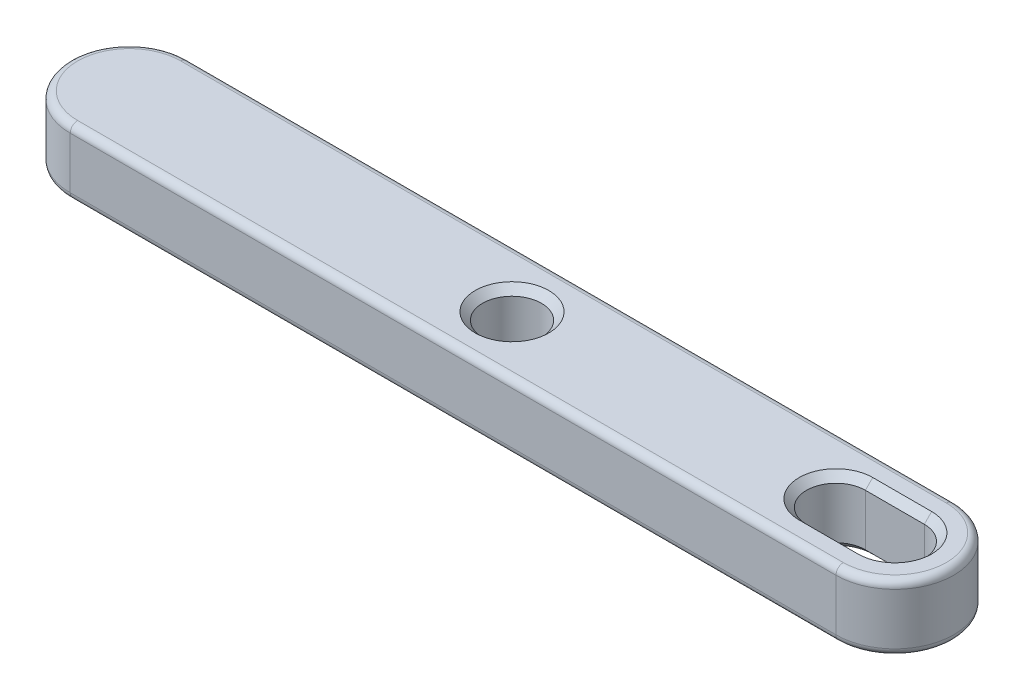
ISO-10303-21;
HEADER;
FILE_DESCRIPTION(('STEP AP214'),'2;1');
FILE_NAME('part.step','',(''),(''),'','','');
FILE_SCHEMA(('AUTOMOTIVE_DESIGN { 1 0 10303 214 1 1 1 1 }'));
ENDSEC;
DATA;
#1=APPLICATION_CONTEXT('core data for automotive mechanical design processes');
#2=APPLICATION_PROTOCOL_DEFINITION('international standard','automotive_design',2000,#1);
#3=PRODUCT_CONTEXT('',#1,'mechanical');
#4=PRODUCT('Part','Part','',(#3));
#5=PRODUCT_RELATED_PRODUCT_CATEGORY('part','',(#4));
#6=PRODUCT_DEFINITION_FORMATION('','',#4);
#7=PRODUCT_DEFINITION_CONTEXT('part definition',#1,'design');
#8=PRODUCT_DEFINITION('design','',#6,#7);
#9=PRODUCT_DEFINITION_SHAPE('','',#8);
#10=(LENGTH_UNIT() NAMED_UNIT(*) SI_UNIT(.MILLI.,.METRE.));
#11=(NAMED_UNIT(*) PLANE_ANGLE_UNIT() SI_UNIT($,.RADIAN.));
#12=(NAMED_UNIT(*) SI_UNIT($,.STERADIAN.) SOLID_ANGLE_UNIT());
#13=UNCERTAINTY_MEASURE_WITH_UNIT(LENGTH_MEASURE(1.E-05),#10,'distance_accuracy_value','');
#14=(GEOMETRIC_REPRESENTATION_CONTEXT(3) GLOBAL_UNCERTAINTY_ASSIGNED_CONTEXT((#13)) GLOBAL_UNIT_ASSIGNED_CONTEXT((#10,
#11,#12)) REPRESENTATION_CONTEXT('',''));
#15=CARTESIAN_POINT('',(0.,0.,0.));
#16=DIRECTION('',(0.,0.,1.));
#17=DIRECTION('',(1.,0.,0.));
#18=AXIS2_PLACEMENT_3D('',#15,#16,#17);
#19=CARTESIAN_POINT('',(-26.,2.25,0.));
#20=DIRECTION('',(0.,1.,0.));
#21=DIRECTION('',(0.,0.,1.));
#22=AXIS2_PLACEMENT_3D('',#19,#20,#21);
#23=PLANE('',#22);
#24=DIRECTION('',(-1.,0.,0.));
#25=VECTOR('',#24,1.);
#26=CARTESIAN_POINT('',(-26.,2.25,-3.5));
#27=LINE('',#26,#25);
#28=CARTESIAN_POINT('',(26.,2.25,-3.5));
#29=VERTEX_POINT('',#28);
#30=CARTESIAN_POINT('',(-26.,2.25,-3.5));
#31=VERTEX_POINT('',#30);
#32=EDGE_CURVE('E205',#29,#31,#27,.T.);
#33=ORIENTED_EDGE('',*,*,#32,.T.);
#34=CARTESIAN_POINT('',(-26.,2.25,0.));
#35=DIRECTION('',(0.,1.,0.));
#36=DIRECTION('',(0.,0.,1.));
#37=AXIS2_PLACEMENT_3D('',#34,#35,#36);
#38=CIRCLE('',#37,3.5);
#39=CARTESIAN_POINT('',(-26.,2.25,3.5));
#40=VERTEX_POINT('',#39);
#41=EDGE_CURVE('E207',#31,#40,#38,.T.);
#42=ORIENTED_EDGE('',*,*,#41,.T.);
#43=DIRECTION('',(1.,0.,0.));
#44=VECTOR('',#43,1.);
#45=CARTESIAN_POINT('',(26.,2.25,3.5));
#46=LINE('',#45,#44);
#47=CARTESIAN_POINT('',(26.,2.25,3.5));
#48=VERTEX_POINT('',#47);
#49=EDGE_CURVE('E200',#40,#48,#46,.T.);
#50=ORIENTED_EDGE('',*,*,#49,.T.);
#51=CARTESIAN_POINT('',(26.,2.25,0.));
#52=DIRECTION('',(0.,1.,0.));
#53=DIRECTION('',(0.,0.,1.));
#54=AXIS2_PLACEMENT_3D('',#51,#52,#53);
#55=CIRCLE('',#54,3.5);
#56=EDGE_CURVE('E202',#48,#29,#55,.T.);
#57=ORIENTED_EDGE('',*,*,#56,.T.);
#58=EDGE_LOOP('',(#33,#42,#50,#57));
#59=FACE_BOUND('',#58,.T.);
#60=CARTESIAN_POINT('',(26.,2.25,0.));
#61=DIRECTION('',(0.,1.,0.));
#62=DIRECTION('',(0.,0.,1.));
#63=AXIS2_PLACEMENT_3D('',#60,#61,#62);
#64=CIRCLE('',#63,2.50000000000001);
#65=CARTESIAN_POINT('',(26.,2.25,-2.50000000000001));
#66=VERTEX_POINT('',#65);
#67=CARTESIAN_POINT('',(26.,2.25,2.50000000000001));
#68=VERTEX_POINT('',#67);
#69=EDGE_CURVE('E313',#66,#68,#64,.F.);
#70=ORIENTED_EDGE('',*,*,#69,.T.);
#71=DIRECTION('',(-1.,0.,0.));
#72=VECTOR('',#71,1.);
#73=CARTESIAN_POINT('',(-26.,2.25,2.50000000000002));
#74=LINE('',#73,#72);
#75=CARTESIAN_POINT('',(22.,2.25,2.50000000000001));
#76=VERTEX_POINT('',#75);
#77=EDGE_CURVE('E203',#68,#76,#74,.T.);
#78=ORIENTED_EDGE('',*,*,#77,.T.);
#79=CARTESIAN_POINT('',(22.,2.25,0.));
#80=DIRECTION('',(0.,1.,0.));
#81=DIRECTION('',(0.,0.,1.));
#82=AXIS2_PLACEMENT_3D('',#79,#80,#81);
#83=CIRCLE('',#82,2.50000000000002);
#84=CARTESIAN_POINT('',(22.,2.25,-2.50000000000002));
#85=VERTEX_POINT('',#84);
#86=EDGE_CURVE('E311',#76,#85,#83,.F.);
#87=ORIENTED_EDGE('',*,*,#86,.T.);
#88=DIRECTION('',(1.,0.,0.));
#89=VECTOR('',#88,1.);
#90=CARTESIAN_POINT('',(-26.,2.25,-2.50000000000015));
#91=LINE('',#90,#89);
#92=EDGE_CURVE('E309',#85,#66,#91,.T.);
#93=ORIENTED_EDGE('',*,*,#92,.T.);
#94=EDGE_LOOP('',(#70,#78,#87,#93));
#95=FACE_BOUND('',#94,.T.);
#96=CARTESIAN_POINT('',(0.,2.25,0.));
#97=DIRECTION('',(0.,1.,0.));
#98=DIRECTION('',(0.,0.,1.));
#99=AXIS2_PLACEMENT_3D('',#96,#97,#98);
#100=CIRCLE('',#99,2.50000000000003);
#101=CARTESIAN_POINT('',(0.,2.25,2.50000000000003));
#102=VERTEX_POINT('',#101);
#103=EDGE_CURVE('E306',#102,#102,#100,.F.);
#104=ORIENTED_EDGE('',*,*,#103,.T.);
#105=EDGE_LOOP('',(#104));
#106=FACE_BOUND('',#105,.T.);
#107=ADVANCED_FACE('F39',(#59,#95,#106),#23,.T.);
#108=CARTESIAN_POINT('',(-26.,-2.25,0.));
#109=DIRECTION('',(0.,1.,0.));
#110=DIRECTION('',(0.,0.,1.));
#111=AXIS2_PLACEMENT_3D('',#108,#109,#110);
#112=PLANE('',#111);
#113=DIRECTION('',(1.,0.,0.));
#114=VECTOR('',#113,1.);
#115=CARTESIAN_POINT('',(-26.,-2.25,3.5));
#116=LINE('',#115,#114);
#117=CARTESIAN_POINT('',(26.,-2.25,3.5));
#118=VERTEX_POINT('',#117);
#119=CARTESIAN_POINT('',(-26.,-2.25,3.5));
#120=VERTEX_POINT('',#119);
#121=EDGE_CURVE('E224',#118,#120,#116,.F.);
#122=ORIENTED_EDGE('',*,*,#121,.T.);
#123=CARTESIAN_POINT('',(-26.,-2.25,0.));
#124=DIRECTION('',(0.,1.,0.));
#125=DIRECTION('',(0.,0.,1.));
#126=AXIS2_PLACEMENT_3D('',#123,#124,#125);
#127=CIRCLE('',#126,3.5);
#128=CARTESIAN_POINT('',(-26.,-2.25,-3.5));
#129=VERTEX_POINT('',#128);
#130=EDGE_CURVE('E229',#120,#129,#127,.F.);
#131=ORIENTED_EDGE('',*,*,#130,.T.);
#132=DIRECTION('',(-1.,0.,0.));
#133=VECTOR('',#132,1.);
#134=CARTESIAN_POINT('',(-26.,-2.25,-3.5));
#135=LINE('',#134,#133);
#136=CARTESIAN_POINT('',(26.,-2.25,-3.5));
#137=VERTEX_POINT('',#136);
#138=EDGE_CURVE('E63',#129,#137,#135,.F.);
#139=ORIENTED_EDGE('',*,*,#138,.T.);
#140=CARTESIAN_POINT('',(26.,-2.25,0.));
#141=DIRECTION('',(0.,1.,0.));
#142=DIRECTION('',(0.,0.,1.));
#143=AXIS2_PLACEMENT_3D('',#140,#141,#142);
#144=CIRCLE('',#143,3.5);
#145=EDGE_CURVE('E226',#137,#118,#144,.F.);
#146=ORIENTED_EDGE('',*,*,#145,.T.);
#147=EDGE_LOOP('',(#122,#131,#139,#146));
#148=FACE_BOUND('',#147,.T.);
#149=DIRECTION('',(1.,0.,0.));
#150=VECTOR('',#149,1.);
#151=CARTESIAN_POINT('',(26.,-2.25,2.50000000000001));
#152=LINE('',#151,#150);
#153=CARTESIAN_POINT('',(22.,-2.25,2.5));
#154=VERTEX_POINT('',#153);
#155=CARTESIAN_POINT('',(26.,-2.25,2.50000000000001));
#156=VERTEX_POINT('',#155);
#157=EDGE_CURVE('E166',#154,#156,#152,.T.);
#158=ORIENTED_EDGE('',*,*,#157,.T.);
#159=CARTESIAN_POINT('',(26.,-2.25,0.));
#160=DIRECTION('',(0.,1.,0.));
#161=DIRECTION('',(0.,0.,1.));
#162=AXIS2_PLACEMENT_3D('',#159,#160,#161);
#163=CIRCLE('',#162,2.5);
#164=CARTESIAN_POINT('',(26.,-2.25,-2.5));
#165=VERTEX_POINT('',#164);
#166=EDGE_CURVE('E162',#156,#165,#163,.T.);
#167=ORIENTED_EDGE('',*,*,#166,.T.);
#168=DIRECTION('',(-1.,0.,0.));
#169=VECTOR('',#168,1.);
#170=CARTESIAN_POINT('',(22.,-2.25,-2.50000000000001));
#171=LINE('',#170,#169);
#172=CARTESIAN_POINT('',(22.,-2.25,-2.50000000000001));
#173=VERTEX_POINT('',#172);
#174=EDGE_CURVE('E155',#165,#173,#171,.T.);
#175=ORIENTED_EDGE('',*,*,#174,.T.);
#176=CARTESIAN_POINT('',(22.,-2.25,0.));
#177=DIRECTION('',(0.,1.,0.));
#178=DIRECTION('',(0.,0.,1.));
#179=AXIS2_PLACEMENT_3D('',#176,#177,#178);
#180=CIRCLE('',#179,2.50000000000001);
#181=EDGE_CURVE('E159',#173,#154,#180,.T.);
#182=ORIENTED_EDGE('',*,*,#181,.T.);
#183=EDGE_LOOP('',(#158,#167,#175,#182));
#184=FACE_BOUND('',#183,.T.);
#185=CARTESIAN_POINT('',(0.,-2.25,0.));
#186=DIRECTION('',(0.,1.,0.));
#187=DIRECTION('',(0.,0.,1.));
#188=AXIS2_PLACEMENT_3D('',#185,#186,#187);
#189=CIRCLE('',#188,2.5);
#190=CARTESIAN_POINT('',(0.,-2.25,2.5));
#191=VERTEX_POINT('',#190);
#192=EDGE_CURVE('E177',#191,#191,#189,.T.);
#193=ORIENTED_EDGE('',*,*,#192,.T.);
#194=EDGE_LOOP('',(#193));
#195=FACE_BOUND('',#194,.T.);
#196=ADVANCED_FACE('F157',(#148,#184,#195),#112,.F.);
#197=CARTESIAN_POINT('',(-26.,2.25,0.));
#198=DIRECTION('',(0.,-1.,0.));
#199=DIRECTION('',(0.,0.,-1.));
#200=AXIS2_PLACEMENT_3D('',#197,#198,#199);
#201=CYLINDRICAL_SURFACE('',#200,4.);
#202=DIRECTION('',(0.,-1.,0.));
#203=VECTOR('',#202,1.);
#204=CARTESIAN_POINT('',(-26.,2.25,4.));
#205=LINE('',#204,#203);
#206=CARTESIAN_POINT('',(-26.,1.75,4.));
#207=VERTEX_POINT('',#206);
#208=CARTESIAN_POINT('',(-26.,-1.75,4.));
#209=VERTEX_POINT('',#208);
#210=EDGE_CURVE('E267',#207,#209,#205,.T.);
#211=ORIENTED_EDGE('',*,*,#210,.F.);
#212=CARTESIAN_POINT('',(-26.,1.75,0.));
#213=DIRECTION('',(0.,1.,0.));
#214=DIRECTION('',(0.,0.,1.));
#215=AXIS2_PLACEMENT_3D('',#212,#213,#214);
#216=CIRCLE('',#215,4.);
#217=CARTESIAN_POINT('',(-26.,1.75,-4.));
#218=VERTEX_POINT('',#217);
#219=EDGE_CURVE('E213',#207,#218,#216,.F.);
#220=ORIENTED_EDGE('',*,*,#219,.T.);
#221=DIRECTION('',(0.,-1.,0.));
#222=VECTOR('',#221,1.);
#223=CARTESIAN_POINT('',(-26.,2.25,-4.));
#224=LINE('',#223,#222);
#225=CARTESIAN_POINT('',(-26.,-1.75,-4.));
#226=VERTEX_POINT('',#225);
#227=EDGE_CURVE('E270',#218,#226,#224,.T.);
#228=ORIENTED_EDGE('',*,*,#227,.T.);
#229=CARTESIAN_POINT('',(-26.,-1.75,0.));
#230=DIRECTION('',(0.,1.,0.));
#231=DIRECTION('',(0.,0.,1.));
#232=AXIS2_PLACEMENT_3D('',#229,#230,#231);
#233=CIRCLE('',#232,4.);
#234=EDGE_CURVE('E210',#226,#209,#233,.T.);
#235=ORIENTED_EDGE('',*,*,#234,.T.);
#236=EDGE_LOOP('',(#211,#220,#228,#235));
#237=FACE_BOUND('',#236,.T.);
#238=ADVANCED_FACE('F266',(#237),#201,.T.);
#239=CARTESIAN_POINT('',(-26.,2.25,4.));
#240=DIRECTION('',(0.,0.,-1.));
#241=DIRECTION('',(-1.,0.,0.));
#242=AXIS2_PLACEMENT_3D('',#239,#240,#241);
#243=PLANE('',#242);
#244=DIRECTION('',(0.,-1.,0.));
#245=VECTOR('',#244,1.);
#246=CARTESIAN_POINT('',(26.,2.25,4.));
#247=LINE('',#246,#245);
#248=CARTESIAN_POINT('',(26.,1.75,4.));
#249=VERTEX_POINT('',#248);
#250=CARTESIAN_POINT('',(26.,-1.75,4.));
#251=VERTEX_POINT('',#250);
#252=EDGE_CURVE('E273',#249,#251,#247,.T.);
#253=ORIENTED_EDGE('',*,*,#252,.F.);
#254=DIRECTION('',(1.,0.,0.));
#255=VECTOR('',#254,1.);
#256=CARTESIAN_POINT('',(-26.,1.75,4.));
#257=LINE('',#256,#255);
#258=EDGE_CURVE('E11',#249,#207,#257,.F.);
#259=ORIENTED_EDGE('',*,*,#258,.T.);
#260=ORIENTED_EDGE('',*,*,#210,.T.);
#261=DIRECTION('',(1.,0.,0.));
#262=VECTOR('',#261,1.);
#263=CARTESIAN_POINT('',(-26.,-1.75,4.));
#264=LINE('',#263,#262);
#265=EDGE_CURVE('E48',#209,#251,#264,.T.);
#266=ORIENTED_EDGE('',*,*,#265,.T.);
#267=EDGE_LOOP('',(#253,#259,#260,#266));
#268=FACE_BOUND('',#267,.T.);
#269=ADVANCED_FACE('F271',(#268),#243,.F.);
#270=CARTESIAN_POINT('',(26.,2.25,0.));
#271=DIRECTION('',(0.,-1.,0.));
#272=DIRECTION('',(0.,0.,-1.));
#273=AXIS2_PLACEMENT_3D('',#270,#271,#272);
#274=CYLINDRICAL_SURFACE('',#273,4.);
#275=DIRECTION('',(0.,-1.,0.));
#276=VECTOR('',#275,1.);
#277=CARTESIAN_POINT('',(26.,2.25,-4.));
#278=LINE('',#277,#276);
#279=CARTESIAN_POINT('',(26.,1.75,-4.));
#280=VERTEX_POINT('',#279);
#281=CARTESIAN_POINT('',(26.,-1.75,-4.));
#282=VERTEX_POINT('',#281);
#283=EDGE_CURVE('E277',#280,#282,#278,.T.);
#284=ORIENTED_EDGE('',*,*,#283,.F.);
#285=CARTESIAN_POINT('',(26.,1.75,0.));
#286=DIRECTION('',(0.,1.,0.));
#287=DIRECTION('',(0.,0.,1.));
#288=AXIS2_PLACEMENT_3D('',#285,#286,#287);
#289=CIRCLE('',#288,4.);
#290=EDGE_CURVE('E222',#280,#249,#289,.F.);
#291=ORIENTED_EDGE('',*,*,#290,.T.);
#292=ORIENTED_EDGE('',*,*,#252,.T.);
#293=CARTESIAN_POINT('',(26.,-1.75,0.));
#294=DIRECTION('',(0.,1.,0.));
#295=DIRECTION('',(0.,0.,1.));
#296=AXIS2_PLACEMENT_3D('',#293,#294,#295);
#297=CIRCLE('',#296,4.);
#298=EDGE_CURVE('E220',#251,#282,#297,.T.);
#299=ORIENTED_EDGE('',*,*,#298,.T.);
#300=EDGE_LOOP('',(#284,#291,#292,#299));
#301=FACE_BOUND('',#300,.T.);
#302=ADVANCED_FACE('F348',(#301),#274,.T.);
#303=CARTESIAN_POINT('',(-26.,2.25,-4.));
#304=DIRECTION('',(0.,0.,1.));
#305=DIRECTION('',(1.,0.,0.));
#306=AXIS2_PLACEMENT_3D('',#303,#304,#305);
#307=PLANE('',#306);
#308=ORIENTED_EDGE('',*,*,#227,.F.);
#309=DIRECTION('',(-1.,0.,0.));
#310=VECTOR('',#309,1.);
#311=CARTESIAN_POINT('',(26.,1.75,-4.));
#312=LINE('',#311,#310);
#313=EDGE_CURVE('E218',#218,#280,#312,.F.);
#314=ORIENTED_EDGE('',*,*,#313,.T.);
#315=ORIENTED_EDGE('',*,*,#283,.T.);
#316=DIRECTION('',(-1.,0.,0.));
#317=VECTOR('',#316,1.);
#318=CARTESIAN_POINT('',(-26.,-1.75,-4.));
#319=LINE('',#318,#317);
#320=EDGE_CURVE('E216',#282,#226,#319,.T.);
#321=ORIENTED_EDGE('',*,*,#320,.T.);
#322=EDGE_LOOP('',(#308,#314,#315,#321));
#323=FACE_BOUND('',#322,.T.);
#324=ADVANCED_FACE('F344',(#323),#307,.F.);
#325=CARTESIAN_POINT('',(0.,2.25,0.));
#326=DIRECTION('',(0.,-1.,0.));
#327=DIRECTION('',(0.,0.,-1.));
#328=AXIS2_PLACEMENT_3D('',#325,#326,#327);
#329=CYLINDRICAL_SURFACE('',#328,2.);
#330=CARTESIAN_POINT('',(0.,-1.74999999999999,0.));
#331=DIRECTION('',(0.,1.,0.));
#332=DIRECTION('',(0.,0.,1.));
#333=AXIS2_PLACEMENT_3D('',#330,#331,#332);
#334=CIRCLE('',#333,2.);
#335=CARTESIAN_POINT('',(0.,-1.74999999999999,2.));
#336=VERTEX_POINT('',#335);
#337=EDGE_CURVE('E303',#336,#336,#334,.F.);
#338=ORIENTED_EDGE('',*,*,#337,.T.);
#339=EDGE_LOOP('',(#338));
#340=FACE_BOUND('',#339,.T.);
#341=CARTESIAN_POINT('',(0.,1.74999999999998,0.));
#342=DIRECTION('',(0.,1.,0.));
#343=DIRECTION('',(0.,0.,1.));
#344=AXIS2_PLACEMENT_3D('',#341,#342,#343);
#345=CIRCLE('',#344,2.);
#346=CARTESIAN_POINT('',(0.,1.74999999999998,2.));
#347=VERTEX_POINT('',#346);
#348=EDGE_CURVE('E300',#347,#347,#345,.T.);
#349=ORIENTED_EDGE('',*,*,#348,.T.);
#350=EDGE_LOOP('',(#349));
#351=FACE_BOUND('',#350,.T.);
#352=ADVANCED_FACE('F382',(#340,#351),#329,.F.);
#353=CARTESIAN_POINT('',(26.,2.25,0.));
#354=DIRECTION('',(0.,-1.,0.));
#355=DIRECTION('',(0.,0.,-1.));
#356=AXIS2_PLACEMENT_3D('',#353,#354,#355);
#357=CYLINDRICAL_SURFACE('',#356,2.);
#358=DIRECTION('',(0.,-1.,0.));
#359=VECTOR('',#358,1.);
#360=CARTESIAN_POINT('',(26.,2.25,-1.99999999999999));
#361=LINE('',#360,#359);
#362=CARTESIAN_POINT('',(26.,1.74999999999999,-1.99999999999999));
#363=VERTEX_POINT('',#362);
#364=CARTESIAN_POINT('',(26.,-1.74999999999999,-1.99999999999999));
#365=VERTEX_POINT('',#364);
#366=EDGE_CURVE('E327',#363,#365,#361,.T.);
#367=ORIENTED_EDGE('',*,*,#366,.T.);
#368=CARTESIAN_POINT('',(26.,-1.74999999999999,0.));
#369=DIRECTION('',(0.,1.,0.));
#370=DIRECTION('',(0.,0.,1.));
#371=AXIS2_PLACEMENT_3D('',#368,#369,#370);
#372=CIRCLE('',#371,2.);
#373=CARTESIAN_POINT('',(26.,-1.74999999999999,2.00000000000001));
#374=VERTEX_POINT('',#373);
#375=EDGE_CURVE('E285',#365,#374,#372,.F.);
#376=ORIENTED_EDGE('',*,*,#375,.T.);
#377=DIRECTION('',(0.,-1.,0.));
#378=VECTOR('',#377,1.);
#379=CARTESIAN_POINT('',(26.,2.25,2.00000000000001));
#380=LINE('',#379,#378);
#381=CARTESIAN_POINT('',(26.,1.74999999999999,2.00000000000001));
#382=VERTEX_POINT('',#381);
#383=EDGE_CURVE('E183',#382,#374,#380,.T.);
#384=ORIENTED_EDGE('',*,*,#383,.F.);
#385=CARTESIAN_POINT('',(26.,1.74999999999999,0.));
#386=DIRECTION('',(0.,1.,0.));
#387=DIRECTION('',(0.,0.,1.));
#388=AXIS2_PLACEMENT_3D('',#385,#386,#387);
#389=CIRCLE('',#388,2.);
#390=EDGE_CURVE('E283',#382,#363,#389,.T.);
#391=ORIENTED_EDGE('',*,*,#390,.T.);
#392=EDGE_LOOP('',(#367,#376,#384,#391));
#393=FACE_BOUND('',#392,.T.);
#394=ADVANCED_FACE('F325',(#393),#357,.F.);
#395=CARTESIAN_POINT('',(26.,2.25,-1.99999999999999));
#396=DIRECTION('',(0.,0.,1.));
#397=DIRECTION('',(1.,0.,0.));
#398=AXIS2_PLACEMENT_3D('',#395,#396,#397);
#399=PLANE('',#398);
#400=DIRECTION('',(0.,-1.,0.));
#401=VECTOR('',#400,1.);
#402=CARTESIAN_POINT('',(22.,2.25,-2.00000000000001));
#403=LINE('',#402,#401);
#404=CARTESIAN_POINT('',(22.,1.74999999999999,-2.00000000000001));
#405=VERTEX_POINT('',#404);
#406=CARTESIAN_POINT('',(22.,-1.74999999999999,-2.00000000000001));
#407=VERTEX_POINT('',#406);
#408=EDGE_CURVE('E335',#405,#407,#403,.T.);
#409=ORIENTED_EDGE('',*,*,#408,.T.);
#410=DIRECTION('',(1.,0.,0.));
#411=VECTOR('',#410,1.);
#412=CARTESIAN_POINT('',(26.,-1.74999999999999,-1.99999999999999));
#413=LINE('',#412,#411);
#414=EDGE_CURVE('E180',#407,#365,#413,.T.);
#415=ORIENTED_EDGE('',*,*,#414,.T.);
#416=ORIENTED_EDGE('',*,*,#366,.F.);
#417=DIRECTION('',(-1.,0.,0.));
#418=VECTOR('',#417,1.);
#419=CARTESIAN_POINT('',(26.,1.74999999999999,-1.99999999999999));
#420=LINE('',#419,#418);
#421=EDGE_CURVE('E288',#363,#405,#420,.T.);
#422=ORIENTED_EDGE('',*,*,#421,.T.);
#423=EDGE_LOOP('',(#409,#415,#416,#422));
#424=FACE_BOUND('',#423,.T.);
#425=ADVANCED_FACE('F468',(#424),#399,.T.);
#426=CARTESIAN_POINT('',(22.,2.25,0.));
#427=DIRECTION('',(0.,-1.,0.));
#428=DIRECTION('',(0.,0.,-1.));
#429=AXIS2_PLACEMENT_3D('',#426,#427,#428);
#430=CYLINDRICAL_SURFACE('',#429,2.00000000000001);
#431=DIRECTION('',(0.,-1.,0.));
#432=VECTOR('',#431,1.);
#433=CARTESIAN_POINT('',(22.,2.25,2.00000000000001));
#434=LINE('',#433,#432);
#435=CARTESIAN_POINT('',(22.,1.74999999999999,2.00000000000001));
#436=VERTEX_POINT('',#435);
#437=CARTESIAN_POINT('',(22.,-1.74999999999999,2.00000000000001));
#438=VERTEX_POINT('',#437);
#439=EDGE_CURVE('E333',#436,#438,#434,.T.);
#440=ORIENTED_EDGE('',*,*,#439,.T.);
#441=CARTESIAN_POINT('',(22.,-1.74999999999999,0.));
#442=DIRECTION('',(0.,1.,0.));
#443=DIRECTION('',(0.,0.,1.));
#444=AXIS2_PLACEMENT_3D('',#441,#442,#443);
#445=CIRCLE('',#444,2.00000000000001);
#446=EDGE_CURVE('E298',#438,#407,#445,.F.);
#447=ORIENTED_EDGE('',*,*,#446,.T.);
#448=ORIENTED_EDGE('',*,*,#408,.F.);
#449=CARTESIAN_POINT('',(22.,1.74999999999999,0.));
#450=DIRECTION('',(0.,1.,0.));
#451=DIRECTION('',(0.,0.,1.));
#452=AXIS2_PLACEMENT_3D('',#449,#450,#451);
#453=CIRCLE('',#452,2.00000000000001);
#454=EDGE_CURVE('E296',#405,#436,#453,.T.);
#455=ORIENTED_EDGE('',*,*,#454,.T.);
#456=EDGE_LOOP('',(#440,#447,#448,#455));
#457=FACE_BOUND('',#456,.T.);
#458=ADVANCED_FACE('F475',(#457),#430,.F.);
#459=CARTESIAN_POINT('',(26.,2.25,2.00000000000001));
#460=DIRECTION('',(0.,0.,-1.));
#461=DIRECTION('',(-1.,0.,0.));
#462=AXIS2_PLACEMENT_3D('',#459,#460,#461);
#463=PLANE('',#462);
#464=ORIENTED_EDGE('',*,*,#383,.T.);
#465=DIRECTION('',(-1.,0.,0.));
#466=VECTOR('',#465,1.);
#467=CARTESIAN_POINT('',(22.,-1.74999999999999,2.00000000000001));
#468=LINE('',#467,#466);
#469=EDGE_CURVE('E294',#374,#438,#468,.T.);
#470=ORIENTED_EDGE('',*,*,#469,.T.);
#471=ORIENTED_EDGE('',*,*,#439,.F.);
#472=DIRECTION('',(1.,0.,0.));
#473=VECTOR('',#472,1.);
#474=CARTESIAN_POINT('',(26.,1.74999999999999,2.00000000000001));
#475=LINE('',#474,#473);
#476=EDGE_CURVE('E291',#436,#382,#475,.T.);
#477=ORIENTED_EDGE('',*,*,#476,.T.);
#478=EDGE_LOOP('',(#464,#470,#471,#477));
#479=FACE_BOUND('',#478,.T.);
#480=ADVANCED_FACE('F329',(#479),#463,.T.);
#481=CARTESIAN_POINT('',(22.,-2.25,0.));
#482=DIRECTION('',(0.,-1.,0.));
#483=DIRECTION('',(0.,0.,-1.));
#484=AXIS2_PLACEMENT_3D('',#481,#482,#483);
#485=CONICAL_SURFACE('',#484,2.50000000000001,0.785398163397442);
#486=DIRECTION('',(0.,-0.707106781186552,-0.707106781186543));
#487=VECTOR('',#486,1.);
#488=CARTESIAN_POINT('',(22.,-1.74999999999999,-2.00000000000001));
#489=LINE('',#488,#487);
#490=EDGE_CURVE('E172',#407,#173,#489,.T.);
#491=ORIENTED_EDGE('',*,*,#490,.F.);
#492=ORIENTED_EDGE('',*,*,#446,.F.);
#493=DIRECTION('',(0.,0.707106781186552,-0.707106781186543));
#494=VECTOR('',#493,1.);
#495=CARTESIAN_POINT('',(22.,-2.25,2.5));
#496=LINE('',#495,#494);
#497=EDGE_CURVE('E175',#154,#438,#496,.T.);
#498=ORIENTED_EDGE('',*,*,#497,.F.);
#499=ORIENTED_EDGE('',*,*,#181,.F.);
#500=EDGE_LOOP('',(#491,#492,#498,#499));
#501=FACE_BOUND('',#500,.T.);
#502=ADVANCED_FACE('F170',(#501),#485,.F.);
#503=CARTESIAN_POINT('',(-26.,-2.25,2.50000000000001));
#504=DIRECTION('',(0.,-0.707106781186543,-0.707106781186552));
#505=DIRECTION('',(-1.,0.,0.));
#506=AXIS2_PLACEMENT_3D('',#503,#504,#505);
#507=PLANE('',#506);
#508=ORIENTED_EDGE('',*,*,#497,.T.);
#509=ORIENTED_EDGE('',*,*,#469,.F.);
#510=DIRECTION('',(0.,0.707106781186552,-0.707106781186543));
#511=VECTOR('',#510,1.);
#512=CARTESIAN_POINT('',(26.,-2.25,2.50000000000001));
#513=LINE('',#512,#511);
#514=EDGE_CURVE('E181',#156,#374,#513,.T.);
#515=ORIENTED_EDGE('',*,*,#514,.F.);
#516=ORIENTED_EDGE('',*,*,#157,.F.);
#517=EDGE_LOOP('',(#508,#509,#515,#516));
#518=FACE_BOUND('',#517,.T.);
#519=ADVANCED_FACE('F406',(#518),#507,.T.);
#520=CARTESIAN_POINT('',(-26.,-2.25,-2.50000000000014));
#521=DIRECTION('',(0.,-0.707106781186543,0.707106781186552));
#522=DIRECTION('',(1.,0.,0.));
#523=AXIS2_PLACEMENT_3D('',#520,#521,#522);
#524=PLANE('',#523);
#525=ORIENTED_EDGE('',*,*,#490,.T.);
#526=ORIENTED_EDGE('',*,*,#174,.F.);
#527=DIRECTION('',(0.,-0.707106781186552,-0.707106781186543));
#528=VECTOR('',#527,1.);
#529=CARTESIAN_POINT('',(26.,-1.74999999999999,-1.99999999999999));
#530=LINE('',#529,#528);
#531=EDGE_CURVE('E185',#365,#165,#530,.T.);
#532=ORIENTED_EDGE('',*,*,#531,.F.);
#533=ORIENTED_EDGE('',*,*,#414,.F.);
#534=EDGE_LOOP('',(#525,#526,#532,#533));
#535=FACE_BOUND('',#534,.T.);
#536=ADVANCED_FACE('F179',(#535),#524,.T.);
#537=CARTESIAN_POINT('',(26.,-2.25,0.));
#538=DIRECTION('',(0.,-1.,0.));
#539=DIRECTION('',(0.,0.,-1.));
#540=AXIS2_PLACEMENT_3D('',#537,#538,#539);
#541=CONICAL_SURFACE('',#540,2.5,0.785398163397442);
#542=ORIENTED_EDGE('',*,*,#514,.T.);
#543=ORIENTED_EDGE('',*,*,#375,.F.);
#544=ORIENTED_EDGE('',*,*,#531,.T.);
#545=ORIENTED_EDGE('',*,*,#166,.F.);
#546=EDGE_LOOP('',(#542,#543,#544,#545));
#547=FACE_BOUND('',#546,.T.);
#548=ADVANCED_FACE('F318',(#547),#541,.F.);
#549=CARTESIAN_POINT('',(0.,-2.25,0.));
#550=DIRECTION('',(0.,-1.,0.));
#551=DIRECTION('',(0.,0.,-1.));
#552=AXIS2_PLACEMENT_3D('',#549,#550,#551);
#553=CONICAL_SURFACE('',#552,2.5,0.785398163397441);
#554=ORIENTED_EDGE('',*,*,#337,.F.);
#555=EDGE_LOOP('',(#554));
#556=FACE_BOUND('',#555,.T.);
#557=ORIENTED_EDGE('',*,*,#192,.F.);
#558=EDGE_LOOP('',(#557));
#559=FACE_BOUND('',#558,.T.);
#560=ADVANCED_FACE('F400',(#556,#559),#553,.F.);
#561=CARTESIAN_POINT('',(26.,1.74999999999999,-1.99999999999999));
#562=DIRECTION('',(0.,-0.707106781186552,-0.707106781186543));
#563=DIRECTION('',(-1.,0.,0.));
#564=AXIS2_PLACEMENT_3D('',#561,#562,#563);
#565=PLANE('',#564);
#566=DIRECTION('',(0.,-0.707106781186543,0.707106781186552));
#567=VECTOR('',#566,1.);
#568=CARTESIAN_POINT('',(26.,2.25,-2.50000000000001));
#569=LINE('',#568,#567);
#570=EDGE_CURVE('E194',#66,#363,#569,.T.);
#571=ORIENTED_EDGE('',*,*,#570,.F.);
#572=ORIENTED_EDGE('',*,*,#92,.F.);
#573=DIRECTION('',(0.,0.707106781186543,-0.707106781186552));
#574=VECTOR('',#573,1.);
#575=CARTESIAN_POINT('',(22.,1.74999999999999,-2.00000000000001));
#576=LINE('',#575,#574);
#577=EDGE_CURVE('E197',#405,#85,#576,.T.);
#578=ORIENTED_EDGE('',*,*,#577,.F.);
#579=ORIENTED_EDGE('',*,*,#421,.F.);
#580=EDGE_LOOP('',(#571,#572,#578,#579));
#581=FACE_BOUND('',#580,.T.);
#582=ADVANCED_FACE('F422',(#581),#565,.F.);
#583=CARTESIAN_POINT('',(22.,1.74999999999999,0.));
#584=DIRECTION('',(0.,1.,0.));
#585=DIRECTION('',(0.,0.,1.));
#586=AXIS2_PLACEMENT_3D('',#583,#584,#585);
#587=CONICAL_SURFACE('',#586,2.00000000000001,0.785398163397455);
#588=ORIENTED_EDGE('',*,*,#577,.T.);
#589=ORIENTED_EDGE('',*,*,#86,.F.);
#590=DIRECTION('',(0.,0.707106781186543,0.707106781186552));
#591=VECTOR('',#590,1.);
#592=CARTESIAN_POINT('',(22.,1.74999999999999,2.));
#593=LINE('',#592,#591);
#594=EDGE_CURVE('E191',#436,#76,#593,.T.);
#595=ORIENTED_EDGE('',*,*,#594,.F.);
#596=ORIENTED_EDGE('',*,*,#454,.F.);
#597=EDGE_LOOP('',(#588,#589,#595,#596));
#598=FACE_BOUND('',#597,.T.);
#599=ADVANCED_FACE('F440',(#598),#587,.F.);
#600=CARTESIAN_POINT('',(26.,1.74999999999999,0.));
#601=DIRECTION('',(0.,1.,0.));
#602=DIRECTION('',(0.,0.,1.));
#603=AXIS2_PLACEMENT_3D('',#600,#601,#602);
#604=CONICAL_SURFACE('',#603,2.,0.785398163397455);
#605=ORIENTED_EDGE('',*,*,#570,.T.);
#606=ORIENTED_EDGE('',*,*,#390,.F.);
#607=DIRECTION('',(0.,-0.707106781186543,-0.707106781186552));
#608=VECTOR('',#607,1.);
#609=CARTESIAN_POINT('',(26.,2.25,2.50000000000001));
#610=LINE('',#609,#608);
#611=EDGE_CURVE('E189',#68,#382,#610,.T.);
#612=ORIENTED_EDGE('',*,*,#611,.F.);
#613=ORIENTED_EDGE('',*,*,#69,.F.);
#614=EDGE_LOOP('',(#605,#606,#612,#613));
#615=FACE_BOUND('',#614,.T.);
#616=ADVANCED_FACE('F433',(#615),#604,.F.);
#617=CARTESIAN_POINT('',(26.,1.74999999999999,2.00000000000001));
#618=DIRECTION('',(0.,-0.707106781186552,0.707106781186543));
#619=DIRECTION('',(1.,0.,0.));
#620=AXIS2_PLACEMENT_3D('',#617,#618,#619);
#621=PLANE('',#620);
#622=ORIENTED_EDGE('',*,*,#594,.T.);
#623=ORIENTED_EDGE('',*,*,#77,.F.);
#624=ORIENTED_EDGE('',*,*,#611,.T.);
#625=ORIENTED_EDGE('',*,*,#476,.F.);
#626=EDGE_LOOP('',(#622,#623,#624,#625));
#627=FACE_BOUND('',#626,.T.);
#628=ADVANCED_FACE('F425',(#627),#621,.F.);
#629=CARTESIAN_POINT('',(0.,1.74999999999998,0.));
#630=DIRECTION('',(0.,1.,0.));
#631=DIRECTION('',(0.,0.,1.));
#632=AXIS2_PLACEMENT_3D('',#629,#630,#631);
#633=CONICAL_SURFACE('',#632,2.,0.785398163397455);
#634=ORIENTED_EDGE('',*,*,#103,.F.);
#635=EDGE_LOOP('',(#634));
#636=FACE_BOUND('',#635,.T.);
#637=ORIENTED_EDGE('',*,*,#348,.F.);
#638=EDGE_LOOP('',(#637));
#639=FACE_BOUND('',#638,.T.);
#640=ADVANCED_FACE('F432',(#636,#639),#633,.F.);
#641=CARTESIAN_POINT('',(26.,1.75,0.));
#642=DIRECTION('',(0.,1.,0.));
#643=DIRECTION('',(0.,0.,1.));
#644=AXIS2_PLACEMENT_3D('',#641,#642,#643);
#645=TOROIDAL_SURFACE('',#644,3.5,0.5);
#646=CARTESIAN_POINT('',(26.,1.75,3.5));
#647=DIRECTION('',(-1.,0.,0.));
#648=DIRECTION('',(0.,0.,1.));
#649=AXIS2_PLACEMENT_3D('',#646,#647,#648);
#650=CIRCLE('',#649,0.5);
#651=EDGE_CURVE('E236',#249,#48,#650,.T.);
#652=ORIENTED_EDGE('',*,*,#651,.F.);
#653=ORIENTED_EDGE('',*,*,#290,.F.);
#654=CARTESIAN_POINT('',(26.,1.75,-3.5));
#655=DIRECTION('',(-1.,0.,0.));
#656=DIRECTION('',(0.,0.,1.));
#657=AXIS2_PLACEMENT_3D('',#654,#655,#656);
#658=CIRCLE('',#657,0.5);
#659=EDGE_CURVE('E192',#29,#280,#658,.T.);
#660=ORIENTED_EDGE('',*,*,#659,.F.);
#661=ORIENTED_EDGE('',*,*,#56,.F.);
#662=EDGE_LOOP('',(#652,#653,#660,#661));
#663=FACE_BOUND('',#662,.T.);
#664=ADVANCED_FACE('F352',(#663),#645,.T.);
#665=CARTESIAN_POINT('',(-26.,1.75,-3.5));
#666=DIRECTION('',(1.,0.,0.));
#667=DIRECTION('',(0.,0.,-1.));
#668=AXIS2_PLACEMENT_3D('',#665,#666,#667);
#669=CYLINDRICAL_SURFACE('',#668,0.5);
#670=ORIENTED_EDGE('',*,*,#659,.T.);
#671=ORIENTED_EDGE('',*,*,#313,.F.);
#672=CARTESIAN_POINT('',(-26.,1.75,-3.5));
#673=DIRECTION('',(-1.,0.,0.));
#674=DIRECTION('',(0.,0.,1.));
#675=AXIS2_PLACEMENT_3D('',#672,#673,#674);
#676=CIRCLE('',#675,0.5);
#677=EDGE_CURVE('E234',#31,#218,#676,.T.);
#678=ORIENTED_EDGE('',*,*,#677,.F.);
#679=ORIENTED_EDGE('',*,*,#32,.F.);
#680=EDGE_LOOP('',(#670,#671,#678,#679));
#681=FACE_BOUND('',#680,.T.);
#682=ADVANCED_FACE('F356',(#681),#669,.T.);
#683=CARTESIAN_POINT('',(-26.,1.75,3.5));
#684=DIRECTION('',(-1.,0.,0.));
#685=DIRECTION('',(0.,0.,1.));
#686=AXIS2_PLACEMENT_3D('',#683,#684,#685);
#687=CYLINDRICAL_SURFACE('',#686,0.5);
#688=ORIENTED_EDGE('',*,*,#651,.T.);
#689=ORIENTED_EDGE('',*,*,#49,.F.);
#690=CARTESIAN_POINT('',(-26.,1.75,3.5));
#691=DIRECTION('',(-1.,0.,0.));
#692=DIRECTION('',(0.,0.,1.));
#693=AXIS2_PLACEMENT_3D('',#690,#691,#692);
#694=CIRCLE('',#693,0.5);
#695=EDGE_CURVE('E232',#207,#40,#694,.T.);
#696=ORIENTED_EDGE('',*,*,#695,.F.);
#697=ORIENTED_EDGE('',*,*,#258,.F.);
#698=EDGE_LOOP('',(#688,#689,#696,#697));
#699=FACE_BOUND('',#698,.T.);
#700=ADVANCED_FACE('F363',(#699),#687,.T.);
#701=CARTESIAN_POINT('',(-26.,1.75,0.));
#702=DIRECTION('',(0.,1.,0.));
#703=DIRECTION('',(0.,0.,1.));
#704=AXIS2_PLACEMENT_3D('',#701,#702,#703);
#705=TOROIDAL_SURFACE('',#704,3.5,0.5);
#706=ORIENTED_EDGE('',*,*,#677,.T.);
#707=ORIENTED_EDGE('',*,*,#219,.F.);
#708=ORIENTED_EDGE('',*,*,#695,.T.);
#709=ORIENTED_EDGE('',*,*,#41,.F.);
#710=EDGE_LOOP('',(#706,#707,#708,#709));
#711=FACE_BOUND('',#710,.T.);
#712=ADVANCED_FACE('F366',(#711),#705,.T.);
#713=CARTESIAN_POINT('',(26.,-1.75,0.));
#714=DIRECTION('',(0.,1.,0.));
#715=DIRECTION('',(0.,0.,1.));
#716=AXIS2_PLACEMENT_3D('',#713,#714,#715);
#717=TOROIDAL_SURFACE('',#716,3.5,0.5);
#718=CARTESIAN_POINT('',(26.,-1.75,3.5));
#719=DIRECTION('',(-1.,0.,0.));
#720=DIRECTION('',(0.,0.,1.));
#721=AXIS2_PLACEMENT_3D('',#718,#719,#720);
#722=CIRCLE('',#721,0.5);
#723=EDGE_CURVE('E243',#118,#251,#722,.T.);
#724=ORIENTED_EDGE('',*,*,#723,.F.);
#725=ORIENTED_EDGE('',*,*,#145,.F.);
#726=CARTESIAN_POINT('',(26.,-1.75,-3.5));
#727=DIRECTION('',(-1.,0.,0.));
#728=DIRECTION('',(0.,0.,1.));
#729=AXIS2_PLACEMENT_3D('',#726,#727,#728);
#730=CIRCLE('',#729,0.5);
#731=EDGE_CURVE('E43',#282,#137,#730,.T.);
#732=ORIENTED_EDGE('',*,*,#731,.F.);
#733=ORIENTED_EDGE('',*,*,#298,.F.);
#734=EDGE_LOOP('',(#724,#725,#732,#733));
#735=FACE_BOUND('',#734,.T.);
#736=ADVANCED_FACE('F41',(#735),#717,.T.);
#737=CARTESIAN_POINT('',(-26.,-1.75,-3.5));
#738=DIRECTION('',(-1.,0.,0.));
#739=DIRECTION('',(0.,0.,1.));
#740=AXIS2_PLACEMENT_3D('',#737,#738,#739);
#741=CYLINDRICAL_SURFACE('',#740,0.5);
#742=ORIENTED_EDGE('',*,*,#731,.T.);
#743=ORIENTED_EDGE('',*,*,#138,.F.);
#744=CARTESIAN_POINT('',(-26.,-1.75,-3.5));
#745=DIRECTION('',(-1.,0.,0.));
#746=DIRECTION('',(0.,0.,1.));
#747=AXIS2_PLACEMENT_3D('',#744,#745,#746);
#748=CIRCLE('',#747,0.5);
#749=EDGE_CURVE('E56',#226,#129,#748,.T.);
#750=ORIENTED_EDGE('',*,*,#749,.F.);
#751=ORIENTED_EDGE('',*,*,#320,.F.);
#752=EDGE_LOOP('',(#742,#743,#750,#751));
#753=FACE_BOUND('',#752,.T.);
#754=ADVANCED_FACE('F253',(#753),#741,.T.);
#755=CARTESIAN_POINT('',(-26.,-1.75,3.5));
#756=DIRECTION('',(1.,0.,0.));
#757=DIRECTION('',(0.,0.,-1.));
#758=AXIS2_PLACEMENT_3D('',#755,#756,#757);
#759=CYLINDRICAL_SURFACE('',#758,0.5);
#760=ORIENTED_EDGE('',*,*,#723,.T.);
#761=ORIENTED_EDGE('',*,*,#265,.F.);
#762=CARTESIAN_POINT('',(-26.,-1.75,3.5));
#763=DIRECTION('',(-1.,0.,0.));
#764=DIRECTION('',(0.,0.,1.));
#765=AXIS2_PLACEMENT_3D('',#762,#763,#764);
#766=CIRCLE('',#765,0.5);
#767=EDGE_CURVE('E241',#120,#209,#766,.T.);
#768=ORIENTED_EDGE('',*,*,#767,.F.);
#769=ORIENTED_EDGE('',*,*,#121,.F.);
#770=EDGE_LOOP('',(#760,#761,#768,#769));
#771=FACE_BOUND('',#770,.T.);
#772=ADVANCED_FACE('F258',(#771),#759,.T.);
#773=CARTESIAN_POINT('',(-26.,-1.75,0.));
#774=DIRECTION('',(0.,1.,0.));
#775=DIRECTION('',(0.,0.,1.));
#776=AXIS2_PLACEMENT_3D('',#773,#774,#775);
#777=TOROIDAL_SURFACE('',#776,3.5,0.5);
#778=ORIENTED_EDGE('',*,*,#749,.T.);
#779=ORIENTED_EDGE('',*,*,#130,.F.);
#780=ORIENTED_EDGE('',*,*,#767,.T.);
#781=ORIENTED_EDGE('',*,*,#234,.F.);
#782=EDGE_LOOP('',(#778,#779,#780,#781));
#783=FACE_BOUND('',#782,.T.);
#784=ADVANCED_FACE('F257',(#783),#777,.T.);
#785=CLOSED_SHELL('',(#107,#196,#238,#269,#302,#324,#352,#394,#425,#458,#480,#502,#519,#536,
#548,#560,#582,#599,#616,#628,#640,#664,#682,#700,#712,#736,#754,#772,#784));
#786=MANIFOLD_SOLID_BREP('B2',#785);
#787=ADVANCED_BREP_SHAPE_REPRESENTATION('',(#18,#786),#14);
#788=SHAPE_DEFINITION_REPRESENTATION(#9,#787);
ENDSEC;
END-ISO-10303-21;
